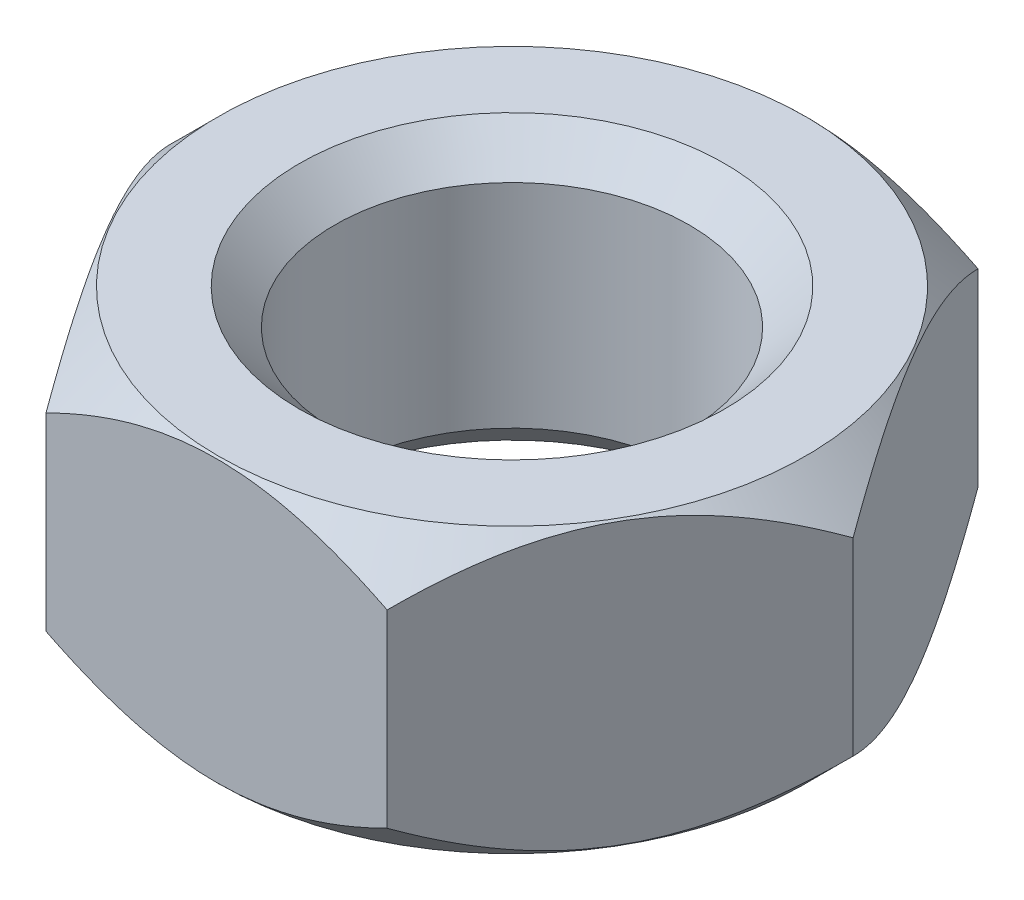
ISO-10303-21;
HEADER;
FILE_DESCRIPTION(('STEP AP214'),'2;1');
FILE_NAME('part.step','',(''),(''),'','','');
FILE_SCHEMA(('AUTOMOTIVE_DESIGN { 1 0 10303 214 1 1 1 1 }'));
ENDSEC;
DATA;
#1=APPLICATION_CONTEXT('core data for automotive mechanical design processes');
#2=APPLICATION_PROTOCOL_DEFINITION('international standard','automotive_design',2000,#1);
#3=PRODUCT_CONTEXT('',#1,'mechanical');
#4=PRODUCT('Part','Part','',(#3));
#5=PRODUCT_RELATED_PRODUCT_CATEGORY('part','',(#4));
#6=PRODUCT_DEFINITION_FORMATION('','',#4);
#7=PRODUCT_DEFINITION_CONTEXT('part definition',#1,'design');
#8=PRODUCT_DEFINITION('design','',#6,#7);
#9=PRODUCT_DEFINITION_SHAPE('','',#8);
#10=(LENGTH_UNIT() NAMED_UNIT(*) SI_UNIT(.MILLI.,.METRE.));
#11=(NAMED_UNIT(*) PLANE_ANGLE_UNIT() SI_UNIT($,.RADIAN.));
#12=(NAMED_UNIT(*) SI_UNIT($,.STERADIAN.) SOLID_ANGLE_UNIT());
#13=UNCERTAINTY_MEASURE_WITH_UNIT(LENGTH_MEASURE(1.E-05),#10,'distance_accuracy_value','');
#14=(GEOMETRIC_REPRESENTATION_CONTEXT(3) GLOBAL_UNCERTAINTY_ASSIGNED_CONTEXT((#13)) GLOBAL_UNIT_ASSIGNED_CONTEXT((#10,
#11,#12)) REPRESENTATION_CONTEXT('',''));
#15=CARTESIAN_POINT('',(0.,0.,0.));
#16=DIRECTION('',(0.,0.,1.));
#17=DIRECTION('',(1.,0.,0.));
#18=AXIS2_PLACEMENT_3D('',#15,#16,#17);
#19=CARTESIAN_POINT('',(-2.88675134594816,-2.4,0.));
#20=DIRECTION('',(-0.86602540378444,0.,-0.499999999999998));
#21=DIRECTION('',(-0.499999999999998,0.,0.86602540378444));
#22=AXIS2_PLACEMENT_3D('',#19,#20,#21);
#23=PLANE('',#22);
#24=CARTESIAN_POINT('',(-2.886866816002,-1.99988452301824,0.000200000000088099));
#25=CARTESIAN_POINT('',(-2.83725032818754,-2.04945929464528,-0.085738277787681));
#26=CARTESIAN_POINT('',(-2.78680418128112,-2.0961225186375,-0.173113567275674));
#27=CARTESIAN_POINT('',(-2.68393890266963,-2.18156185996172,-0.351281456165519));
#28=CARTESIAN_POINT('',(-2.63150998769862,-2.22029043759402,-0.44209100068101));
#29=CARTESIAN_POINT('',(-2.52578957716235,-2.28663329610229,-0.625204123126866));
#30=CARTESIAN_POINT('',(-2.47252500720905,-2.31441433146918,-0.71746106452929));
#31=CARTESIAN_POINT('',(-2.36482323343211,-2.35721682408937,-0.904006008776246));
#32=CARTESIAN_POINT('',(-2.31038931995913,-2.3722702333287,-0.998288312566249));
#33=CARTESIAN_POINT('',(-2.21657570605387,-2.38585227779056,-1.16077825829182));
#34=CARTESIAN_POINT('',(-2.17731721011878,-2.38786290075924,-1.22877596788012));
#35=CARTESIAN_POINT('',(-2.0988643883567,-2.38447588281256,-1.36466024116919));
#36=CARTESIAN_POINT('',(-2.05967008984862,-2.37907564470023,-1.43254675755221));
#37=CARTESIAN_POINT('',(-1.98165157555715,-2.36117421159758,-1.56767878823608));
#38=CARTESIAN_POINT('',(-1.94282782326097,-2.34866507295357,-1.63492349975353));
#39=CARTESIAN_POINT('',(-1.86585167424616,-2.31723249804434,-1.76825010081817));
#40=CARTESIAN_POINT('',(-1.82769922629678,-2.29830955350323,-1.83433207909963));
#41=CARTESIAN_POINT('',(-1.72997445583858,-2.2421326385918,-2.00359634669124));
#42=CARTESIAN_POINT('',(-1.67100807039231,-2.20064416840386,-2.10572912222287));
#43=CARTESIAN_POINT('',(-1.58430317001562,-2.13060595327696,-2.2559064149405));
#44=CARTESIAN_POINT('',(-1.55573003305807,-2.10599774788397,-2.3053965398826));
#45=CARTESIAN_POINT('',(-1.49911303110425,-2.0545381132848,-2.40346006383884));
#46=CARTESIAN_POINT('',(-1.47106885396705,-2.02768806122068,-2.45203400349692));
#47=CARTESIAN_POINT('',(-1.44326020292022,-1.99988452301827,-2.5002));
#48=B_SPLINE_CURVE_WITH_KNOTS('',3,(#24,#25,#26,#27,#28,#29,#30,#31,#32,#33,#34,#35,#36,#37,#38,
#39,#40,#41,#42,#43,#44,#45,#46,#47),.UNSPECIFIED.,.F.,.F.,(4,2,2,2,2,2,2,2,2,2,2,4),(0.,
0.333012085133944,0.667964518301437,0.997597032043358,1.32639954393852,1.56169424147176,
1.7970714210209,2.03271213522178,2.26833478775658,2.64260240809542,2.82922877818874,
3.01574133749036),.UNSPECIFIED.);
#49=CARTESIAN_POINT('',(-2.88675134594816,-2.,0.));
#50=VERTEX_POINT('',#49);
#51=CARTESIAN_POINT('',(-1.44337567297413,-2.,-2.5));
#52=VERTEX_POINT('',#51);
#53=EDGE_CURVE('E156',#50,#52,#48,.T.);
#54=ORIENTED_EDGE('',*,*,#53,.F.);
#55=DIRECTION('',(0.,1.,0.));
#56=VECTOR('',#55,1.);
#57=CARTESIAN_POINT('',(-2.88675134594816,-2.4,0.));
#58=LINE('',#57,#56);
#59=CARTESIAN_POINT('',(-2.88675134594816,-0.4,0.));
#60=VERTEX_POINT('',#59);
#61=EDGE_CURVE('E52',#50,#60,#58,.T.);
#62=ORIENTED_EDGE('',*,*,#61,.T.);
#63=CARTESIAN_POINT('',(-1.44326020292022,-0.400115476981726,-2.5002));
#64=CARTESIAN_POINT('',(-1.49287669073468,-0.350540705354688,-2.41426172221223));
#65=CARTESIAN_POINT('',(-1.54332283764109,-0.303877481362466,-2.32688643272424));
#66=CARTESIAN_POINT('',(-1.64618811625258,-0.21843814003826,-2.14871854383441));
#67=CARTESIAN_POINT('',(-1.69861703122358,-0.17970956240596,-2.05790899931892));
#68=CARTESIAN_POINT('',(-1.80433744175985,-0.113366703897696,-1.87479587687307));
#69=CARTESIAN_POINT('',(-1.85760201171315,-0.0855856685308129,-1.78253893547065));
#70=CARTESIAN_POINT('',(-1.96530378549008,-0.0427831759106217,-1.59599399122371));
#71=CARTESIAN_POINT('',(-2.01973769896306,-0.0277297666712993,-1.50171168743371));
#72=CARTESIAN_POINT('',(-2.11355131286832,-0.0141477222094366,-1.33922174170815));
#73=CARTESIAN_POINT('',(-2.1528098088034,-0.0121370992407565,-1.27122403211984));
#74=CARTESIAN_POINT('',(-2.23126263056548,-0.0155241171874431,-1.13533975883077));
#75=CARTESIAN_POINT('',(-2.27045692907356,-0.020924355299775,-1.06745324244776));
#76=CARTESIAN_POINT('',(-2.34847544336503,-0.0388257884024258,-0.93232121176389));
#77=CARTESIAN_POINT('',(-2.38729919566121,-0.0513349270464343,-0.865076500246436));
#78=CARTESIAN_POINT('',(-2.46427534467602,-0.0827675019556602,-0.731749899181798));
#79=CARTESIAN_POINT('',(-2.5024277926254,-0.101690446496771,-0.66566792090034));
#80=CARTESIAN_POINT('',(-2.60015256308361,-0.157867361408205,-0.496403653308718));
#81=CARTESIAN_POINT('',(-2.65911894852989,-0.199355831596151,-0.394270877777074));
#82=CARTESIAN_POINT('',(-2.74582384890658,-0.269394046723064,-0.244093585059437));
#83=CARTESIAN_POINT('',(-2.77439698586414,-0.294002252116055,-0.19460346011733));
#84=CARTESIAN_POINT('',(-2.83101398781796,-0.345461886715226,-0.0965399361610786));
#85=CARTESIAN_POINT('',(-2.85905816495516,-0.372311938779351,-0.0479659965029907));
#86=CARTESIAN_POINT('',(-2.886866816002,-0.400115476981764,0.000200000000088264));
#87=B_SPLINE_CURVE_WITH_KNOTS('',3,(#63,#64,#65,#66,#67,#68,#69,#70,#71,#72,#73,#74,#75,#76,#77,
#78,#79,#80,#81,#82,#83,#84,#85,#86),.UNSPECIFIED.,.F.,.F.,(4,2,2,2,2,2,2,2,2,2,2,4),(0.,
0.333012085133927,0.667964518301402,0.997597032043305,1.32639954393845,1.56169424147169,
1.79707142102083,2.03271213522171,2.26833478775651,2.64260240809539,2.82922877818872,
3.01574133749036),.UNSPECIFIED.);
#88=CARTESIAN_POINT('',(-1.44337567297413,-0.4,-2.5));
#89=VERTEX_POINT('',#88);
#90=EDGE_CURVE('E112',#89,#60,#87,.T.);
#91=ORIENTED_EDGE('',*,*,#90,.F.);
#92=DIRECTION('',(0.,1.,0.));
#93=VECTOR('',#92,1.);
#94=CARTESIAN_POINT('',(-1.44337567297406,-2.4,-2.5));
#95=LINE('',#94,#93);
#96=EDGE_CURVE('E117',#52,#89,#95,.T.);
#97=ORIENTED_EDGE('',*,*,#96,.F.);
#98=EDGE_LOOP('',(#54,#62,#91,#97));
#99=FACE_BOUND('',#98,.T.);
#100=ADVANCED_FACE('F29',(#99),#23,.T.);
#101=CARTESIAN_POINT('',(-1.44337567297406,-2.4,-2.5));
#102=DIRECTION('',(0.,0.,-1.));
#103=DIRECTION('',(-1.,0.,0.));
#104=AXIS2_PLACEMENT_3D('',#101,#102,#103);
#105=PLANE('',#104);
#106=CARTESIAN_POINT('',(-3.00686055371766,-0.976353618158406,-2.5));
#107=CARTESIAN_POINT('',(-2.93419555888552,-1.03221607337774,-2.5));
#108=CARTESIAN_POINT('',(-2.8611384247871,-1.08757646670912,-2.5));
#109=CARTESIAN_POINT('',(-2.71407981532172,-1.19706393459546,-2.5));
#110=CARTESIAN_POINT('',(-2.64007812012032,-1.25119071356557,-2.5));
#111=CARTESIAN_POINT('',(-2.49042948244741,-1.35836696314182,-2.5));
#112=CARTESIAN_POINT('',(-2.41477425074887,-1.4114048975212,-2.5));
#113=CARTESIAN_POINT('',(-2.26220362121972,-1.51562994486785,-2.5));
#114=CARTESIAN_POINT('',(-2.18528831077203,-1.56681718539265,-2.5));
#115=CARTESIAN_POINT('',(-2.02506944859289,-1.6700886834191,-2.5));
#116=CARTESIAN_POINT('',(-1.94166976020541,-1.72202454073649,-2.5));
#117=CARTESIAN_POINT('',(-1.77293705034365,-1.82264970945442,-2.5));
#118=CARTESIAN_POINT('',(-1.68760428279983,-1.87133944399226,-2.5));
#119=CARTESIAN_POINT('',(-1.51494654751409,-1.9644589961223,-2.5));
#120=CARTESIAN_POINT('',(-1.42762805695319,-2.00890072943998,-2.5));
#121=CARTESIAN_POINT('',(-1.25052598836292,-2.09252041448136,-2.5));
#122=CARTESIAN_POINT('',(-1.16074359560958,-2.13170084552657,-2.5));
#123=CARTESIAN_POINT('',(-0.98744876450011,-2.19986634956689,-2.5));
#124=CARTESIAN_POINT('',(-0.904183815953156,-2.22947420660822,-2.5));
#125=CARTESIAN_POINT('',(-0.735537147436124,-2.28202460534028,-2.5));
#126=CARTESIAN_POINT('',(-0.65015529262312,-2.30496672124592,-2.5));
#127=CARTESIAN_POINT('',(-0.479269044896119,-2.34256324017883,-2.5));
#128=CARTESIAN_POINT('',(-0.39379825748821,-2.35736782471579,-2.5));
#129=CARTESIAN_POINT('',(-0.221800656818383,-2.37838119922811,-2.5));
#130=CARTESIAN_POINT('',(-0.135274064759336,-2.38459175958053,-2.5));
#131=CARTESIAN_POINT('',(0.0341972844239789,-2.38789077242592,-2.5));
#132=CARTESIAN_POINT('',(0.117134633959634,-2.38536316670756,-2.5));
#133=CARTESIAN_POINT('',(0.282359134963951,-2.37220538779436,-2.5));
#134=CARTESIAN_POINT('',(0.364646226507277,-2.36157447642817,-2.5));
#135=CARTESIAN_POINT('',(0.529371902600402,-2.33263042886053,-2.5));
#136=CARTESIAN_POINT('',(0.6117863224983,-2.31418185991864,-2.5));
#137=CARTESIAN_POINT('',(0.774792600762078,-2.27062146640925,-2.5));
#138=CARTESIAN_POINT('',(0.855384564360703,-2.24551002764257,-2.5));
#139=CARTESIAN_POINT('',(1.1036144369275,-2.15857448547193,-2.5));
#140=CARTESIAN_POINT('',(1.26787783896323,-2.08708426100726,-2.5));
#141=CARTESIAN_POINT('',(1.50828630391717,-1.9678317101188,-2.5));
#142=CARTESIAN_POINT('',(1.58757208675449,-1.92598541374091,-2.5));
#143=CARTESIAN_POINT('',(1.74434886235114,-1.83904848715485,-2.5));
#144=CARTESIAN_POINT('',(1.82184016785801,-1.79395842799223,-2.5));
#145=CARTESIAN_POINT('',(1.97144914574765,-1.70347587232084,-2.5));
#146=CARTESIAN_POINT('',(2.04364321095733,-1.65820826454684,-2.5));
#147=CARTESIAN_POINT('',(2.18679260951688,-1.56574579934053,-2.5));
#148=CARTESIAN_POINT('',(2.25774784938503,-1.5185507973567,-2.5));
#149=CARTESIAN_POINT('',(2.39800921618397,-1.42296288976774,-2.5));
#150=CARTESIAN_POINT('',(2.46732401135529,-1.37458265081056,-2.5));
#151=CARTESIAN_POINT('',(2.60500280846684,-1.27652582638536,-2.5));
#152=CARTESIAN_POINT('',(2.67336706722706,-1.22684960193218,-2.5));
#153=CARTESIAN_POINT('',(2.74133281290672,-1.17664277730505,-2.5));
#154=B_SPLINE_CURVE_WITH_KNOTS('',3,(#106,#107,#108,#109,#110,#111,#112,#113,#114,#115,#116,
#117,#118,#119,#120,#121,#122,#123,#124,#125,#126,#127,#128,#129,#130,#131,#132,#133,#134,#135,
#136,#137,#138,#139,#140,#141,#142,#143,#144,#145,#146,#147,#148,#149,#150,#151,#152,#153),
.UNSPECIFIED.,.F.,.F.,(4,2,2,2,2,2,2,2,2,2,2,2,2,2,2,2,2,2,2,2,2,2,2,4),(0.,0.274972945669422,
0.550011098949862,0.827171617457954,1.10431299634799,1.39900138095483,1.6936512770503,
1.98744880343442,2.28110739196182,2.54599586001028,2.81090124452367,3.07073779539666,
3.33052081172374,3.57903710621171,3.82757604201934,4.08060901187179,4.3336273335272,
4.86940614188284,5.13833706913142,5.40722076796741,5.66282656673244,5.9184515708595,
6.17202334349369,6.42552521890798),.UNSPECIFIED.);
#155=CARTESIAN_POINT('',(1.44337567297403,-2.,-2.50000000000005));
#156=VERTEX_POINT('',#155);
#157=EDGE_CURVE('E159',#52,#156,#154,.T.);
#158=ORIENTED_EDGE('',*,*,#157,.F.);
#159=ORIENTED_EDGE('',*,*,#96,.T.);
#160=CARTESIAN_POINT('',(-3.00686055371766,-1.42364638184159,-2.5));
#161=CARTESIAN_POINT('',(-2.93419555888552,-1.36778392662226,-2.5));
#162=CARTESIAN_POINT('',(-2.86113842478711,-1.31242353329088,-2.5));
#163=CARTESIAN_POINT('',(-2.71407981532172,-1.20293606540454,-2.5));
#164=CARTESIAN_POINT('',(-2.64007812012033,-1.14880928643443,-2.5));
#165=CARTESIAN_POINT('',(-2.49042948244741,-1.04163303685818,-2.5));
#166=CARTESIAN_POINT('',(-2.41477425074887,-0.988595102478801,-2.5));
#167=CARTESIAN_POINT('',(-2.26220362121972,-0.884370055132155,-2.5));
#168=CARTESIAN_POINT('',(-2.18528831077203,-0.833182814607346,-2.5));
#169=CARTESIAN_POINT('',(-2.0250694485929,-0.729911316580901,-2.5));
#170=CARTESIAN_POINT('',(-1.94166976020541,-0.677975459263515,-2.5));
#171=CARTESIAN_POINT('',(-1.77293705034366,-0.577350290545577,-2.5));
#172=CARTESIAN_POINT('',(-1.68760428279983,-0.528660556007737,-2.5));
#173=CARTESIAN_POINT('',(-1.51494654751409,-0.435541003877702,-2.5));
#174=CARTESIAN_POINT('',(-1.42762805695319,-0.391099270560025,-2.5));
#175=CARTESIAN_POINT('',(-1.25052598836292,-0.307479585518642,-2.5));
#176=CARTESIAN_POINT('',(-1.16074359560958,-0.268299154473432,-2.5));
#177=CARTESIAN_POINT('',(-0.987448764500111,-0.200133650433108,-2.5));
#178=CARTESIAN_POINT('',(-0.904183815953156,-0.170525793391776,-2.5));
#179=CARTESIAN_POINT('',(-0.735537147436124,-0.117975394659717,-2.5));
#180=CARTESIAN_POINT('',(-0.65015529262312,-0.0950332787540773,-2.5));
#181=CARTESIAN_POINT('',(-0.479269044896119,-0.057436759821169,-2.5));
#182=CARTESIAN_POINT('',(-0.393798257488211,-0.0426321752842073,-2.5));
#183=CARTESIAN_POINT('',(-0.221800656818383,-0.0216188007718851,-2.5));
#184=CARTESIAN_POINT('',(-0.135274064759336,-0.0154082404194727,-2.5));
#185=CARTESIAN_POINT('',(0.0341972844239785,-0.012109227574078,-2.5));
#186=CARTESIAN_POINT('',(0.117134633959634,-0.0146368332924353,-2.5));
#187=CARTESIAN_POINT('',(0.28235913496395,-0.0277946122056384,-2.5));
#188=CARTESIAN_POINT('',(0.364646226507277,-0.0384255235718258,-2.5));
#189=CARTESIAN_POINT('',(0.529371902600402,-0.0673695711394719,-2.5));
#190=CARTESIAN_POINT('',(0.6117863224983,-0.085818140081362,-2.5));
#191=CARTESIAN_POINT('',(0.774792600762078,-0.129378533590748,-2.5));
#192=CARTESIAN_POINT('',(0.855384564360703,-0.15448997235743,-2.5));
#193=CARTESIAN_POINT('',(1.1036144369275,-0.241425514528068,-2.5));
#194=CARTESIAN_POINT('',(1.26787783896323,-0.31291573899274,-2.5));
#195=CARTESIAN_POINT('',(1.50828630391717,-0.432168289881204,-2.5));
#196=CARTESIAN_POINT('',(1.58757208675449,-0.474014586259089,-2.5));
#197=CARTESIAN_POINT('',(1.74434886235114,-0.560951512845149,-2.5));
#198=CARTESIAN_POINT('',(1.82184016785801,-0.606041572007765,-2.5));
#199=CARTESIAN_POINT('',(1.97144914574765,-0.696524127679163,-2.5));
#200=CARTESIAN_POINT('',(2.04364321095733,-0.741791735453161,-2.5));
#201=CARTESIAN_POINT('',(2.18679260951688,-0.834254200659471,-2.5));
#202=CARTESIAN_POINT('',(2.25774784938503,-0.881449202643297,-2.5));
#203=CARTESIAN_POINT('',(2.39800921618397,-0.977037110232258,-2.5));
#204=CARTESIAN_POINT('',(2.4673240113553,-1.02541734918944,-2.5));
#205=CARTESIAN_POINT('',(2.60500280846685,-1.12347417361463,-2.5));
#206=CARTESIAN_POINT('',(2.67336706722706,-1.17315039806782,-2.5));
#207=CARTESIAN_POINT('',(2.74133281290672,-1.22335722269495,-2.5));
#208=B_SPLINE_CURVE_WITH_KNOTS('',3,(#160,#161,#162,#163,#164,#165,#166,#167,#168,#169,#170,
#171,#172,#173,#174,#175,#176,#177,#178,#179,#180,#181,#182,#183,#184,#185,#186,#187,#188,#189,
#190,#191,#192,#193,#194,#195,#196,#197,#198,#199,#200,#201,#202,#203,#204,#205,#206,#207),
.UNSPECIFIED.,.F.,.F.,(4,2,2,2,2,2,2,2,2,2,2,2,2,2,2,2,2,2,2,2,2,2,2,4),(0.,0.274972945669422,
0.550011098949862,0.827171617457952,1.10431299634798,1.39900138095483,1.6936512770503,
1.98744880343442,2.28110739196182,2.54599586001029,2.81090124452367,3.07073779539666,
3.33052081172374,3.57903710621171,3.82757604201934,4.08060901187179,4.3336273335272,
4.86940614188284,5.13833706913142,5.40722076796742,5.66282656673244,5.9184515708595,
6.17202334349369,6.42552521890798),.UNSPECIFIED.);
#209=CARTESIAN_POINT('',(1.44337567297404,-0.4,-2.50000000000006));
#210=VERTEX_POINT('',#209);
#211=EDGE_CURVE('E203',#210,#89,#208,.F.);
#212=ORIENTED_EDGE('',*,*,#211,.F.);
#213=DIRECTION('',(0.,1.,0.));
#214=VECTOR('',#213,1.);
#215=CARTESIAN_POINT('',(1.44337567297407,-2.4,-2.5));
#216=LINE('',#215,#214);
#217=EDGE_CURVE('E106',#156,#210,#216,.T.);
#218=ORIENTED_EDGE('',*,*,#217,.F.);
#219=EDGE_LOOP('',(#158,#159,#212,#218));
#220=FACE_BOUND('',#219,.T.);
#221=ADVANCED_FACE('F148',(#220),#105,.T.);
#222=CARTESIAN_POINT('',(1.44337567297407,-2.4,-2.5));
#223=DIRECTION('',(0.866025403784439,0.,-0.499999999999999));
#224=DIRECTION('',(-0.5,0.,-0.866025403784439));
#225=AXIS2_PLACEMENT_3D('',#222,#223,#224);
#226=PLANE('',#225);
#227=CARTESIAN_POINT('',(1.44326020292023,-1.99988452301827,-2.5002));
#228=CARTESIAN_POINT('',(1.49287669073469,-2.0494592946453,-2.41426172221224));
#229=CARTESIAN_POINT('',(1.5433228376411,-2.09612251863753,-2.32688643272425));
#230=CARTESIAN_POINT('',(1.64618811625259,-2.18156185996173,-2.14871854383441));
#231=CARTESIAN_POINT('',(1.6986170312236,-2.22029043759403,-2.05790899931893));
#232=CARTESIAN_POINT('',(1.80433744175986,-2.28663329610229,-1.87479587687308));
#233=CARTESIAN_POINT('',(1.85760201171316,-2.31441433146918,-1.78253893547066));
#234=CARTESIAN_POINT('',(1.96530378549009,-2.35721682408937,-1.59599399122372));
#235=CARTESIAN_POINT('',(2.01973769896306,-2.37227023332869,-1.50171168743372));
#236=CARTESIAN_POINT('',(2.11355131286833,-2.38585227779055,-1.33922174170816));
#237=CARTESIAN_POINT('',(2.15280980880341,-2.38786290075923,-1.27122403211985));
#238=CARTESIAN_POINT('',(2.23126263056549,-2.38447588281254,-1.13533975883078));
#239=CARTESIAN_POINT('',(2.27045692907357,-2.37907564470021,-1.06745324244777));
#240=CARTESIAN_POINT('',(2.34847544336504,-2.36117421159756,-0.932321211763899));
#241=CARTESIAN_POINT('',(2.38729919566123,-2.34866507295355,-0.865076500246444));
#242=CARTESIAN_POINT('',(2.46427534467603,-2.31723249804433,-0.731749899181806));
#243=CARTESIAN_POINT('',(2.50242779262541,-2.29830955350321,-0.665667920900348));
#244=CARTESIAN_POINT('',(2.60015256308362,-2.24213263859179,-0.496403653308737));
#245=CARTESIAN_POINT('',(2.65911894852989,-2.20064416840384,-0.394270877777105));
#246=CARTESIAN_POINT('',(2.74582384890657,-2.13060595327694,-0.244093585059483));
#247=CARTESIAN_POINT('',(2.77439698586413,-2.10599774788395,-0.194603460117381));
#248=CARTESIAN_POINT('',(2.83101398781794,-2.05453811328479,-0.0965399361611407));
#249=CARTESIAN_POINT('',(2.85905816495514,-2.02768806122067,-0.047965996503058));
#250=CARTESIAN_POINT('',(2.88686681600198,-1.99988452301826,0.000200000000016019));
#251=B_SPLINE_CURVE_WITH_KNOTS('',3,(#227,#228,#229,#230,#231,#232,#233,#234,#235,#236,#237,
#238,#239,#240,#241,#242,#243,#244,#245,#246,#247,#248,#249,#250),.UNSPECIFIED.,.F.,.F.,(4,2,2,
2,2,2,2,2,2,2,2,4),(0.,0.333012085133924,0.667964518301397,0.997597032043298,1.32639954393844,
1.56169424147168,1.79707142102082,2.0327121352217,2.2683347877565,2.64260240809534,
2.82922877818865,3.01574133749027),.UNSPECIFIED.);
#252=CARTESIAN_POINT('',(2.88675134594816,-2.,0.));
#253=VERTEX_POINT('',#252);
#254=EDGE_CURVE('E86',#156,#253,#251,.T.);
#255=ORIENTED_EDGE('',*,*,#254,.F.);
#256=ORIENTED_EDGE('',*,*,#217,.T.);
#257=CARTESIAN_POINT('',(2.88686681600198,-0.400115476981741,0.000200000000016092));
#258=CARTESIAN_POINT('',(2.83725032818752,-0.350540705354703,-0.0857382777877494));
#259=CARTESIAN_POINT('',(2.7868041812811,-0.303877481362481,-0.173113567275739));
#260=CARTESIAN_POINT('',(2.68393890266961,-0.218438140038274,-0.351281456165575));
#261=CARTESIAN_POINT('',(2.63150998769861,-0.179709562405974,-0.442091000681062));
#262=CARTESIAN_POINT('',(2.52578957716234,-0.113366703897709,-0.62520412312691));
#263=CARTESIAN_POINT('',(2.47252500720904,-0.0855856685308262,-0.71746106452933));
#264=CARTESIAN_POINT('',(2.36482323343211,-0.042783175910635,-0.904006008776277));
#265=CARTESIAN_POINT('',(2.31038931995913,-0.0277297666713128,-0.998288312566275));
#266=CARTESIAN_POINT('',(2.21657570605387,-0.0141477222094498,-1.16077825829184));
#267=CARTESIAN_POINT('',(2.17731721011879,-0.0121370992407694,-1.22877596788014));
#268=CARTESIAN_POINT('',(2.09886438835671,-0.0155241171874556,-1.36466024116921));
#269=CARTESIAN_POINT('',(2.05967008984862,-0.0209243552997876,-1.43254675755223));
#270=CARTESIAN_POINT('',(1.98165157555715,-0.0388257884024387,-1.5676787882361));
#271=CARTESIAN_POINT('',(1.94282782326097,-0.0513349270464473,-1.63492349975355));
#272=CARTESIAN_POINT('',(1.86585167424617,-0.0827675019556733,-1.76825010081819));
#273=CARTESIAN_POINT('',(1.82769922629678,-0.101690446496784,-1.83433207909965));
#274=CARTESIAN_POINT('',(1.72997445583858,-0.157867361408213,-2.00359634669126));
#275=CARTESIAN_POINT('',(1.67100807039231,-0.199355831596154,-2.10572912222289));
#276=CARTESIAN_POINT('',(1.58430317001563,-0.269394046723055,-2.25590641494051));
#277=CARTESIAN_POINT('',(1.55573003305808,-0.294002252116041,-2.30539653988261));
#278=CARTESIAN_POINT('',(1.49911303110426,-0.345461886715204,-2.40346006383885));
#279=CARTESIAN_POINT('',(1.47106885396706,-0.372311938779324,-2.45203400349693));
#280=CARTESIAN_POINT('',(1.44326020292023,-0.400115476981733,-2.5002));
#281=B_SPLINE_CURVE_WITH_KNOTS('',3,(#257,#258,#259,#260,#261,#262,#263,#264,#265,#266,#267,
#268,#269,#270,#271,#272,#273,#274,#275,#276,#277,#278,#279,#280),.UNSPECIFIED.,.F.,.F.,(4,2,2,
2,2,2,2,2,2,2,2,4),(0.,0.333012085133928,0.667964518301404,0.997597032043309,1.32639954393846,
1.5616942414717,1.79707142102084,2.03271213522172,2.26833478775652,2.64260240809535,
2.82922877818866,3.01574133749027),.UNSPECIFIED.);
#282=CARTESIAN_POINT('',(2.88675134594816,-0.4,0.));
#283=VERTEX_POINT('',#282);
#284=EDGE_CURVE('E197',#283,#210,#281,.T.);
#285=ORIENTED_EDGE('',*,*,#284,.F.);
#286=DIRECTION('',(0.,1.,0.));
#287=VECTOR('',#286,1.);
#288=CARTESIAN_POINT('',(2.88675134594814,-2.4,0.));
#289=LINE('',#288,#287);
#290=EDGE_CURVE('E104',#253,#283,#289,.T.);
#291=ORIENTED_EDGE('',*,*,#290,.F.);
#292=EDGE_LOOP('',(#255,#256,#285,#291));
#293=FACE_BOUND('',#292,.T.);
#294=ADVANCED_FACE('F153',(#293),#226,.T.);
#295=CARTESIAN_POINT('',(2.88675134594814,-2.4,0.));
#296=DIRECTION('',(0.866025403784436,0.,0.500000000000005));
#297=DIRECTION('',(0.500000000000005,0.,-0.866025403784436));
#298=AXIS2_PLACEMENT_3D('',#295,#296,#297);
#299=PLANE('',#298);
#300=CARTESIAN_POINT('',(2.88686681600198,-1.99988452301826,-0.000199999999983968));
#301=CARTESIAN_POINT('',(2.83725032818752,-2.0494592946453,0.0857382777877805));
#302=CARTESIAN_POINT('',(2.7868041812811,-2.09612251863752,0.173113567275769));
#303=CARTESIAN_POINT('',(2.68393890266961,-2.18156185996172,0.351281456165604));
#304=CARTESIAN_POINT('',(2.63150998769861,-2.22029043759402,0.442091000681089));
#305=CARTESIAN_POINT('',(2.52578957716234,-2.28663329610229,0.625204123126935));
#306=CARTESIAN_POINT('',(2.47252500720904,-2.31441433146917,0.717461064529354));
#307=CARTESIAN_POINT('',(2.3648232334321,-2.35721682408936,0.904006008776299));
#308=CARTESIAN_POINT('',(2.31038931995913,-2.37227023332868,0.998288312566296));
#309=CARTESIAN_POINT('',(2.21657570605387,-2.38585227779054,1.16077825829186));
#310=CARTESIAN_POINT('',(2.17731721011878,-2.38786290075922,1.22877596788016));
#311=CARTESIAN_POINT('',(2.0988643883567,-2.38447588281254,1.36466024116923));
#312=CARTESIAN_POINT('',(2.05967008984862,-2.37907564470021,1.43254675755225));
#313=CARTESIAN_POINT('',(1.98165157555715,-2.36117421159755,1.56767878823612));
#314=CARTESIAN_POINT('',(1.94282782326097,-2.34866507295354,1.63492349975357));
#315=CARTESIAN_POINT('',(1.86585167424616,-2.31723249804432,1.76825010081821));
#316=CARTESIAN_POINT('',(1.82769922629677,-2.29830955350321,1.83433207909967));
#317=CARTESIAN_POINT('',(1.72997445583857,-2.24213263859178,2.00359634669128));
#318=CARTESIAN_POINT('',(1.67100807039229,-2.20064416840383,2.10572912222292));
#319=CARTESIAN_POINT('',(1.5843031700156,-2.13060595327693,2.25590641494055));
#320=CARTESIAN_POINT('',(1.55573003305805,-2.10599774788394,2.30539653988265));
#321=CARTESIAN_POINT('',(1.49911303110423,-2.05453811328477,2.40346006383889));
#322=CARTESIAN_POINT('',(1.47106885396703,-2.02768806122065,2.45203400349698));
#323=CARTESIAN_POINT('',(1.44326020292019,-1.99988452301824,2.50020000000006));
#324=B_SPLINE_CURVE_WITH_KNOTS('',3,(#300,#301,#302,#303,#304,#305,#306,#307,#308,#309,#310,
#311,#312,#313,#314,#315,#316,#317,#318,#319,#320,#321,#322,#323),.UNSPECIFIED.,.F.,.F.,(4,2,2,
2,2,2,2,2,2,2,2,4),(0.,0.333012085133925,0.667964518301398,0.9975970320433,1.32639954393844,
1.56169424147169,1.79707142102083,2.03271213522171,2.26833478775651,2.64260240809536,
2.82922877818868,3.01574133749031),.UNSPECIFIED.);
#325=CARTESIAN_POINT('',(1.44337567297403,-2.,2.50000000000005));
#326=VERTEX_POINT('',#325);
#327=EDGE_CURVE('E82',#253,#326,#324,.T.);
#328=ORIENTED_EDGE('',*,*,#327,.F.);
#329=ORIENTED_EDGE('',*,*,#290,.T.);
#330=CARTESIAN_POINT('',(1.44326020292019,-0.400115476981763,2.50020000000006));
#331=CARTESIAN_POINT('',(1.49287669073465,-0.350540705354724,2.41426172221229));
#332=CARTESIAN_POINT('',(1.54332283764107,-0.3038774813625,2.3268864327243));
#333=CARTESIAN_POINT('',(1.64618811625257,-0.21843814003829,2.14871854383446));
#334=CARTESIAN_POINT('',(1.69861703122357,-0.179709562405988,2.05790899931897));
#335=CARTESIAN_POINT('',(1.80433744175984,-0.113366703897721,1.87479587687312));
#336=CARTESIAN_POINT('',(1.85760201171314,-0.0855856685308365,1.7825389354707));
#337=CARTESIAN_POINT('',(1.96530378549008,-0.0427831759106434,1.59599399122374));
#338=CARTESIAN_POINT('',(2.01973769896306,-0.0277297666713203,1.50171168743374));
#339=CARTESIAN_POINT('',(2.11355131286832,-0.0141477222094569,1.33922174170818));
#340=CARTESIAN_POINT('',(2.15280980880341,-0.0121370992407765,1.27122403211987));
#341=CARTESIAN_POINT('',(2.23126263056549,-0.0155241171874628,1.13533975883081));
#342=CARTESIAN_POINT('',(2.27045692907357,-0.0209243552997947,1.06745324244779));
#343=CARTESIAN_POINT('',(2.34847544336504,-0.0388257884024455,0.932321211763919));
#344=CARTESIAN_POINT('',(2.38729919566122,-0.051334927046454,0.865076500246465));
#345=CARTESIAN_POINT('',(2.46427534467603,-0.08276750195568,0.731749899181826));
#346=CARTESIAN_POINT('',(2.50242779262542,-0.101690446496791,0.665667920900368));
#347=CARTESIAN_POINT('',(2.60015256308362,-0.15786736140822,0.496403653308759));
#348=CARTESIAN_POINT('',(2.65911894852989,-0.199355831596161,0.394270877777129));
#349=CARTESIAN_POINT('',(2.74582384890658,-0.269394046723062,0.244093585059511));
#350=CARTESIAN_POINT('',(2.77439698586413,-0.294002252116049,0.19460346011741));
#351=CARTESIAN_POINT('',(2.83101398781794,-0.345461886715211,0.0965399361611708));
#352=CARTESIAN_POINT('',(2.85905816495514,-0.372311938779332,0.0479659965030887));
#353=CARTESIAN_POINT('',(2.88686681600198,-0.400115476981741,-0.000199999999984082));
#354=B_SPLINE_CURVE_WITH_KNOTS('',3,(#330,#331,#332,#333,#334,#335,#336,#337,#338,#339,#340,
#341,#342,#343,#344,#345,#346,#347,#348,#349,#350,#351,#352,#353),.UNSPECIFIED.,.F.,.F.,(4,2,2,
2,2,2,2,2,2,2,2,4),(0.,0.333012085133936,0.66796451830142,0.997597032043333,1.32639954393849,
1.56169424147173,1.79707142102087,2.03271213522175,2.26833478775655,2.64260240809538,
2.82922877818869,3.01574133749031),.UNSPECIFIED.);
#355=CARTESIAN_POINT('',(1.44337567297403,-0.4,2.50000000000006));
#356=VERTEX_POINT('',#355);
#357=EDGE_CURVE('E103',#356,#283,#354,.T.);
#358=ORIENTED_EDGE('',*,*,#357,.F.);
#359=DIRECTION('',(0.,1.,0.));
#360=VECTOR('',#359,1.);
#361=CARTESIAN_POINT('',(1.44337567297403,-2.4,2.50000000000006));
#362=LINE('',#361,#360);
#363=EDGE_CURVE('E95',#326,#356,#362,.T.);
#364=ORIENTED_EDGE('',*,*,#363,.F.);
#365=EDGE_LOOP('',(#328,#329,#358,#364));
#366=FACE_BOUND('',#365,.T.);
#367=ADVANCED_FACE('F101',(#366),#299,.T.);
#368=CARTESIAN_POINT('',(1.44337567297403,-2.4,2.50000000000006));
#369=DIRECTION('',(0.,0.,1.));
#370=DIRECTION('',(1.,0.,0.));
#371=AXIS2_PLACEMENT_3D('',#368,#369,#370);
#372=PLANE('',#371);
#373=CARTESIAN_POINT('',(-3.00686055371769,-0.976353618158347,2.50000000000006));
#374=CARTESIAN_POINT('',(-2.93419555888555,-1.03221607337768,2.50000000000006));
#375=CARTESIAN_POINT('',(-2.86113842478713,-1.08757646670906,2.50000000000006));
#376=CARTESIAN_POINT('',(-2.71407981532175,-1.1970639345954,2.50000000000006));
#377=CARTESIAN_POINT('',(-2.64007812012035,-1.25119071356551,2.50000000000006));
#378=CARTESIAN_POINT('',(-2.49042948244744,-1.35836696314176,2.50000000000006));
#379=CARTESIAN_POINT('',(-2.41477425074889,-1.41140489752114,2.50000000000006));
#380=CARTESIAN_POINT('',(-2.26220362121974,-1.51562994486779,2.50000000000006));
#381=CARTESIAN_POINT('',(-2.18528831077205,-1.5668171853926,2.50000000000006));
#382=CARTESIAN_POINT('',(-2.02506944859291,-1.67008868341904,2.50000000000006));
#383=CARTESIAN_POINT('',(-1.94166976020543,-1.72202454073643,2.50000000000006));
#384=CARTESIAN_POINT('',(-1.77293705034367,-1.82264970945437,2.50000000000006));
#385=CARTESIAN_POINT('',(-1.68760428279984,-1.87133944399221,2.50000000000006));
#386=CARTESIAN_POINT('',(-1.5149465475141,-1.96445899612224,2.50000000000006));
#387=CARTESIAN_POINT('',(-1.4276280569532,-2.00890072943992,2.50000000000006));
#388=CARTESIAN_POINT('',(-1.25052598836293,-2.0925204144813,2.50000000000006));
#389=CARTESIAN_POINT('',(-1.16074359560959,-2.13170084552651,2.50000000000006));
#390=CARTESIAN_POINT('',(-0.987448764500116,-2.19986634956684,2.50000000000006));
#391=CARTESIAN_POINT('',(-0.904183815953161,-2.22947420660817,2.50000000000006));
#392=CARTESIAN_POINT('',(-0.735537147436126,-2.28202460534023,2.50000000000006));
#393=CARTESIAN_POINT('',(-0.650155292623121,-2.30496672124587,2.50000000000006));
#394=CARTESIAN_POINT('',(-0.479269044896117,-2.34256324017878,2.50000000000006));
#395=CARTESIAN_POINT('',(-0.393798257488207,-2.35736782471574,2.50000000000006));
#396=CARTESIAN_POINT('',(-0.221800656818378,-2.37838119922806,2.50000000000006));
#397=CARTESIAN_POINT('',(-0.135274064759329,-2.38459175958047,2.50000000000006));
#398=CARTESIAN_POINT('',(0.0341972844239877,-2.38789077242587,2.50000000000006));
#399=CARTESIAN_POINT('',(0.117134633959645,-2.38536316670751,2.50000000000006));
#400=CARTESIAN_POINT('',(0.282359134963964,-2.3722053877943,2.50000000000006));
#401=CARTESIAN_POINT('',(0.364646226507292,-2.36157447642812,2.50000000000006));
#402=CARTESIAN_POINT('',(0.529371902600419,-2.33263042886047,2.50000000000006));
#403=CARTESIAN_POINT('',(0.611786322498318,-2.31418185991858,2.50000000000006));
#404=CARTESIAN_POINT('',(0.774792600762099,-2.27062146640919,2.50000000000006));
#405=CARTESIAN_POINT('',(0.855384564360725,-2.24551002764251,2.50000000000006));
#406=CARTESIAN_POINT('',(1.10361443692753,-2.15857448547187,2.50000000000006));
#407=CARTESIAN_POINT('',(1.26787783896326,-2.0870842610072,2.50000000000006));
#408=CARTESIAN_POINT('',(1.5082863039172,-1.96783171011873,2.50000000000006));
#409=CARTESIAN_POINT('',(1.58757208675453,-1.92598541374084,2.50000000000006));
#410=CARTESIAN_POINT('',(1.74434886235118,-1.83904848715478,2.50000000000006));
#411=CARTESIAN_POINT('',(1.82184016785805,-1.79395842799216,2.50000000000006));
#412=CARTESIAN_POINT('',(1.9714491457477,-1.70347587232076,2.50000000000006));
#413=CARTESIAN_POINT('',(2.04364321095738,-1.65820826454676,2.50000000000006));
#414=CARTESIAN_POINT('',(2.18679260951694,-1.56574579934045,2.50000000000006));
#415=CARTESIAN_POINT('',(2.25774784938509,-1.51855079735662,2.50000000000006));
#416=CARTESIAN_POINT('',(2.39800921618402,-1.42296288976766,2.50000000000006));
#417=CARTESIAN_POINT('',(2.46732401135535,-1.37458265081048,2.50000000000006));
#418=CARTESIAN_POINT('',(2.60500280846691,-1.27652582638528,2.50000000000006));
#419=CARTESIAN_POINT('',(2.67336706722712,-1.22684960193209,2.50000000000006));
#420=CARTESIAN_POINT('',(2.74133281290678,-1.17664277730496,2.50000000000006));
#421=B_SPLINE_CURVE_WITH_KNOTS('',3,(#373,#374,#375,#376,#377,#378,#379,#380,#381,#382,#383,
#384,#385,#386,#387,#388,#389,#390,#391,#392,#393,#394,#395,#396,#397,#398,#399,#400,#401,#402,
#403,#404,#405,#406,#407,#408,#409,#410,#411,#412,#413,#414,#415,#416,#417,#418,#419,#420),
.UNSPECIFIED.,.F.,.F.,(4,2,2,2,2,2,2,2,2,2,2,2,2,2,2,2,2,2,2,2,2,2,2,4),(0.,0.274972945669425,
0.550011098949867,0.827171617457961,1.104312996348,1.39900138095484,1.69365127705032,
1.98744880343444,2.28110739196184,2.54599586001031,2.8109012445237,3.0707377953967,
3.33052081172378,3.57903710621175,3.82757604201939,4.08060901187184,4.33362733352725,
4.86940614188291,5.13833706913149,5.40722076796749,5.66282656673253,5.91845157085959,
6.17202334349378,6.42552521890808),.UNSPECIFIED.);
#422=CARTESIAN_POINT('',(-1.44337567297408,-2.,2.50000000000006));
#423=VERTEX_POINT('',#422);
#424=EDGE_CURVE('E44',#326,#423,#421,.F.);
#425=ORIENTED_EDGE('',*,*,#424,.F.);
#426=ORIENTED_EDGE('',*,*,#363,.T.);
#427=CARTESIAN_POINT('',(-3.00686055371769,-1.42364638184165,2.50000000000006));
#428=CARTESIAN_POINT('',(-2.93419555888555,-1.36778392662232,2.50000000000006));
#429=CARTESIAN_POINT('',(-2.86113842478713,-1.31242353329094,2.50000000000006));
#430=CARTESIAN_POINT('',(-2.71407981532175,-1.2029360654046,2.50000000000006));
#431=CARTESIAN_POINT('',(-2.64007812012035,-1.14880928643449,2.50000000000006));
#432=CARTESIAN_POINT('',(-2.49042948244744,-1.04163303685824,2.50000000000006));
#433=CARTESIAN_POINT('',(-2.41477425074889,-0.988595102478858,2.50000000000006));
#434=CARTESIAN_POINT('',(-2.26220362121974,-0.884370055132211,2.50000000000006));
#435=CARTESIAN_POINT('',(-2.18528831077205,-0.833182814607402,2.50000000000006));
#436=CARTESIAN_POINT('',(-2.02506944859291,-0.729911316580956,2.50000000000006));
#437=CARTESIAN_POINT('',(-1.94166976020543,-0.67797545926357,2.50000000000006));
#438=CARTESIAN_POINT('',(-1.77293705034367,-0.577350290545631,2.50000000000006));
#439=CARTESIAN_POINT('',(-1.68760428279984,-0.528660556007792,2.50000000000006));
#440=CARTESIAN_POINT('',(-1.5149465475141,-0.435541003877757,2.50000000000006));
#441=CARTESIAN_POINT('',(-1.4276280569532,-0.39109927056008,2.50000000000006));
#442=CARTESIAN_POINT('',(-1.25052598836293,-0.307479585518697,2.50000000000006));
#443=CARTESIAN_POINT('',(-1.16074359560959,-0.268299154473487,2.50000000000006));
#444=CARTESIAN_POINT('',(-0.987448764500117,-0.200133650433163,2.50000000000006));
#445=CARTESIAN_POINT('',(-0.904183815953162,-0.170525793391831,2.50000000000006));
#446=CARTESIAN_POINT('',(-0.735537147436127,-0.117975394659772,2.50000000000006));
#447=CARTESIAN_POINT('',(-0.650155292623121,-0.0950332787541317,2.50000000000006));
#448=CARTESIAN_POINT('',(-0.479269044896117,-0.0574367598212237,2.50000000000006));
#449=CARTESIAN_POINT('',(-0.393798257488208,-0.0426321752842628,2.50000000000006));
#450=CARTESIAN_POINT('',(-0.221800656818378,-0.0216188007719409,2.50000000000006));
#451=CARTESIAN_POINT('',(-0.135274064759329,-0.0154082404195282,2.50000000000006));
#452=CARTESIAN_POINT('',(0.0341972844239883,-0.0121092275741337,2.50000000000006));
#453=CARTESIAN_POINT('',(0.117134633959645,-0.0146368332924916,2.50000000000006));
#454=CARTESIAN_POINT('',(0.282359134963964,-0.0277946122056955,2.50000000000006));
#455=CARTESIAN_POINT('',(0.364646226507292,-0.0384255235718832,2.50000000000006));
#456=CARTESIAN_POINT('',(0.52937190260042,-0.0673695711395301,2.50000000000006));
#457=CARTESIAN_POINT('',(0.611786322498319,-0.0858181400814206,2.50000000000006));
#458=CARTESIAN_POINT('',(0.7747926007621,-0.129378533590807,2.50000000000006));
#459=CARTESIAN_POINT('',(0.855384564360726,-0.15448997235749,2.50000000000006));
#460=CARTESIAN_POINT('',(1.10361443692753,-0.241425514528131,2.50000000000006));
#461=CARTESIAN_POINT('',(1.26787783896326,-0.312915738992804,2.50000000000006));
#462=CARTESIAN_POINT('',(1.50828630391721,-0.432168289881271,2.50000000000006));
#463=CARTESIAN_POINT('',(1.58757208675453,-0.474014586259158,2.50000000000006));
#464=CARTESIAN_POINT('',(1.74434886235118,-0.560951512845219,2.50000000000006));
#465=CARTESIAN_POINT('',(1.82184016785805,-0.606041572007837,2.50000000000006));
#466=CARTESIAN_POINT('',(1.9714491457477,-0.696524127679236,2.50000000000006));
#467=CARTESIAN_POINT('',(2.04364321095738,-0.741791735453236,2.50000000000006));
#468=CARTESIAN_POINT('',(2.18679260951694,-0.834254200659549,2.50000000000006));
#469=CARTESIAN_POINT('',(2.25774784938509,-0.881449202643375,2.50000000000006));
#470=CARTESIAN_POINT('',(2.39800921618403,-0.977037110232339,2.50000000000006));
#471=CARTESIAN_POINT('',(2.46732401135536,-1.02541734918952,2.50000000000006));
#472=CARTESIAN_POINT('',(2.60500280846691,-1.12347417361472,2.50000000000006));
#473=CARTESIAN_POINT('',(2.67336706722712,-1.17315039806791,2.50000000000006));
#474=CARTESIAN_POINT('',(2.74133281290679,-1.22335722269504,2.50000000000006));
#475=B_SPLINE_CURVE_WITH_KNOTS('',3,(#427,#428,#429,#430,#431,#432,#433,#434,#435,#436,#437,
#438,#439,#440,#441,#442,#443,#444,#445,#446,#447,#448,#449,#450,#451,#452,#453,#454,#455,#456,
#457,#458,#459,#460,#461,#462,#463,#464,#465,#466,#467,#468,#469,#470,#471,#472,#473,#474),
.UNSPECIFIED.,.F.,.F.,(4,2,2,2,2,2,2,2,2,2,2,2,2,2,2,2,2,2,2,2,2,2,2,4),(0.,0.274972945669425,
0.550011098949868,0.827171617457962,1.104312996348,1.39900138095484,1.69365127705032,
1.98744880343444,2.28110739196184,2.54599586001031,2.8109012445237,3.0707377953967,
3.33052081172378,3.57903710621175,3.82757604201939,4.08060901187184,4.33362733352725,
4.86940614188291,5.13833706913149,5.4072207679675,5.66282656673253,5.91845157085959,
6.17202334349379,6.42552521890809),.UNSPECIFIED.);
#476=CARTESIAN_POINT('',(-1.44337567297411,-0.4,2.50000000000001));
#477=VERTEX_POINT('',#476);
#478=EDGE_CURVE('E165',#477,#356,#475,.T.);
#479=ORIENTED_EDGE('',*,*,#478,.F.);
#480=DIRECTION('',(0.,1.,0.));
#481=VECTOR('',#480,1.);
#482=CARTESIAN_POINT('',(-1.44337567297408,-2.4,2.50000000000006));
#483=LINE('',#482,#481);
#484=EDGE_CURVE('E97',#423,#477,#483,.T.);
#485=ORIENTED_EDGE('',*,*,#484,.F.);
#486=EDGE_LOOP('',(#425,#426,#479,#485));
#487=FACE_BOUND('',#486,.T.);
#488=ADVANCED_FACE('F93',(#487),#372,.T.);
#489=CARTESIAN_POINT('',(-1.44337567297408,-2.4,2.50000000000006));
#490=DIRECTION('',(-0.866025403784434,0.,0.500000000000008));
#491=DIRECTION('',(0.500000000000008,0.,0.866025403784434));
#492=AXIS2_PLACEMENT_3D('',#489,#490,#491);
#493=PLANE('',#492);
#494=CARTESIAN_POINT('',(-1.44326020292025,-1.99988452301821,2.50020000000006));
#495=CARTESIAN_POINT('',(-1.49287669073471,-2.04945929464525,2.41426172221229));
#496=CARTESIAN_POINT('',(-1.54332283764112,-2.09612251863747,2.3268864327243));
#497=CARTESIAN_POINT('',(-1.64618811625262,-2.18156185996167,2.14871854383447));
#498=CARTESIAN_POINT('',(-1.69861703122362,-2.22029043759397,2.05790899931898));
#499=CARTESIAN_POINT('',(-1.80433744175988,-2.28663329610224,1.87479587687313));
#500=CARTESIAN_POINT('',(-1.85760201171318,-2.31441433146912,1.78253893547071));
#501=CARTESIAN_POINT('',(-1.96530378549012,-2.35721682408931,1.59599399122377));
#502=CARTESIAN_POINT('',(-2.0197376989631,-2.37227023332863,1.50171168743377));
#503=CARTESIAN_POINT('',(-2.11355131286836,-2.38585227779049,1.33922174170821));
#504=CARTESIAN_POINT('',(-2.15280980880345,-2.38786290075917,1.2712240321199));
#505=CARTESIAN_POINT('',(-2.23126263056553,-2.38447588281249,1.13533975883083));
#506=CARTESIAN_POINT('',(-2.27045692907362,-2.37907564470015,1.06745324244781));
#507=CARTESIAN_POINT('',(-2.34847544336509,-2.3611742115975,0.932321211763941));
#508=CARTESIAN_POINT('',(-2.38729919566127,-2.34866507295349,0.865076500246486));
#509=CARTESIAN_POINT('',(-2.46427534467608,-2.31723249804427,0.731749899181845));
#510=CARTESIAN_POINT('',(-2.50242779262547,-2.29830955350315,0.665667920900386));
#511=CARTESIAN_POINT('',(-2.60015256308366,-2.24213263859173,0.496403653308786));
#512=CARTESIAN_POINT('',(-2.65911894852993,-2.20064416840379,0.394270877777166));
#513=CARTESIAN_POINT('',(-2.74582384890661,-2.1306059532769,0.244093585059562));
#514=CARTESIAN_POINT('',(-2.77439698586416,-2.10599774788391,0.194603460117465));
#515=CARTESIAN_POINT('',(-2.83101398781797,-2.05453811328476,0.0965399361612344));
#516=CARTESIAN_POINT('',(-2.85905816495516,-2.02768806122064,0.0479659965031568));
#517=CARTESIAN_POINT('',(-2.886866816002,-1.99988452301824,-0.00019999999991166));
#518=B_SPLINE_CURVE_WITH_KNOTS('',3,(#494,#495,#496,#497,#498,#499,#500,#501,#502,#503,#504,
#505,#506,#507,#508,#509,#510,#511,#512,#513,#514,#515,#516,#517),.UNSPECIFIED.,.F.,.F.,(4,2,2,
2,2,2,2,2,2,2,2,4),(0.,0.333012085133927,0.667964518301403,0.997597032043307,1.32639954393845,
1.5616942414717,1.79707142102085,2.03271213522173,2.26833478775653,2.64260240809533,
2.82922877818862,3.01574133749022),.UNSPECIFIED.);
#519=EDGE_CURVE('E98',#423,#50,#518,.T.);
#520=ORIENTED_EDGE('',*,*,#519,.F.);
#521=ORIENTED_EDGE('',*,*,#484,.T.);
#522=CARTESIAN_POINT('',(-2.886866816002,-0.400115476981764,-0.000199999999911963));
#523=CARTESIAN_POINT('',(-2.83725032818754,-0.35054070535473,0.0857382777878505));
#524=CARTESIAN_POINT('',(-2.78680418128113,-0.303877481362511,0.173113567275837));
#525=CARTESIAN_POINT('',(-2.68393890266964,-0.218438140038312,0.351281456165667));
#526=CARTESIAN_POINT('',(-2.63150998769863,-0.179709562406015,0.44209100068115));
#527=CARTESIAN_POINT('',(-2.52578957716237,-0.113366703897756,0.625204123126991));
#528=CARTESIAN_POINT('',(-2.47252500720907,-0.0855856685308759,0.717461064529408));
#529=CARTESIAN_POINT('',(-2.36482323343214,-0.042783175910689,0.904006008776348));
#530=CARTESIAN_POINT('',(-2.31038931995916,-0.0277297666713683,0.998288312566342));
#531=CARTESIAN_POINT('',(-2.2165757060539,-0.0141477222095067,1.1607782582919));
#532=CARTESIAN_POINT('',(-2.17731721011882,-0.0121370992408267,1.22877596788021));
#533=CARTESIAN_POINT('',(-2.09886438835673,-0.0155241171875142,1.36466024116928));
#534=CARTESIAN_POINT('',(-2.05967008984865,-0.020924355299847,1.4325467575523));
#535=CARTESIAN_POINT('',(-1.98165157555717,-0.0388257884024993,1.56767878823617));
#536=CARTESIAN_POINT('',(-1.94282782326099,-0.0513349270465085,1.63492349975362));
#537=CARTESIAN_POINT('',(-1.86585167424618,-0.0827675019557357,1.76825010081826));
#538=CARTESIAN_POINT('',(-1.8276992262968,-0.101690446496848,1.83433207909972));
#539=CARTESIAN_POINT('',(-1.7299744558386,-0.157867361408277,2.00359634669133));
#540=CARTESIAN_POINT('',(-1.67100807039233,-0.199355831596216,2.10572912222295));
#541=CARTESIAN_POINT('',(-1.58430317001564,-0.269394046723116,2.25590641494057));
#542=CARTESIAN_POINT('',(-1.55573003305809,-0.294002252116102,2.30539653988267));
#543=CARTESIAN_POINT('',(-1.49911303110428,-0.345461886715262,2.4034600638389));
#544=CARTESIAN_POINT('',(-1.47106885396708,-0.372311938779382,2.45203400349698));
#545=CARTESIAN_POINT('',(-1.44326020292025,-0.40011547698179,2.50020000000006));
#546=B_SPLINE_CURVE_WITH_KNOTS('',3,(#522,#523,#524,#525,#526,#527,#528,#529,#530,#531,#532,
#533,#534,#535,#536,#537,#538,#539,#540,#541,#542,#543,#544,#545),.UNSPECIFIED.,.F.,.F.,(4,2,2,
2,2,2,2,2,2,2,2,4),(0.,0.333012085133915,0.667964518301378,0.997597032043271,1.32639954393841,
1.56169424147165,1.7970714210208,2.03271213522168,2.26833478775648,2.64260240809531,
2.82922877818861,3.01574133749022),.UNSPECIFIED.);
#547=EDGE_CURVE('E163',#60,#477,#546,.T.);
#548=ORIENTED_EDGE('',*,*,#547,.F.);
#549=ORIENTED_EDGE('',*,*,#61,.F.);
#550=EDGE_LOOP('',(#520,#521,#548,#549));
#551=FACE_BOUND('',#550,.T.);
#552=ADVANCED_FACE('F135',(#551),#493,.T.);
#553=CARTESIAN_POINT('',(-2.88675134594816,-2.4,0.));
#554=DIRECTION('',(0.,1.,0.));
#555=DIRECTION('',(0.,0.,1.));
#556=AXIS2_PLACEMENT_3D('',#553,#554,#555);
#557=PLANE('',#556);
#558=CARTESIAN_POINT('',(0.,-2.4,0.));
#559=DIRECTION('',(0.,1.,0.));
#560=DIRECTION('',(0.,0.,1.));
#561=AXIS2_PLACEMENT_3D('',#558,#559,#560);
#562=CIRCLE('',#561,2.48675134594816);
#563=CARTESIAN_POINT('',(0.,-2.4,2.48675134594816));
#564=VERTEX_POINT('',#563);
#565=EDGE_CURVE('E307',#564,#564,#562,.T.);
#566=ORIENTED_EDGE('',*,*,#565,.F.);
#567=EDGE_LOOP('',(#566));
#568=FACE_BOUND('',#567,.T.);
#569=CARTESIAN_POINT('',(0.,-2.4,0.));
#570=DIRECTION('',(0.,1.,0.));
#571=DIRECTION('',(0.,0.,1.));
#572=AXIS2_PLACEMENT_3D('',#569,#570,#571);
#573=CIRCLE('',#572,1.8);
#574=CARTESIAN_POINT('',(0.,-2.4,1.8));
#575=VERTEX_POINT('',#574);
#576=EDGE_CURVE('E113',#575,#575,#573,.T.);
#577=ORIENTED_EDGE('',*,*,#576,.T.);
#578=EDGE_LOOP('',(#577));
#579=FACE_BOUND('',#578,.T.);
#580=ADVANCED_FACE('F132',(#568,#579),#557,.F.);
#581=CARTESIAN_POINT('',(-2.88675134594816,0.,0.));
#582=DIRECTION('',(0.,1.,0.));
#583=DIRECTION('',(0.,0.,1.));
#584=AXIS2_PLACEMENT_3D('',#581,#582,#583);
#585=PLANE('',#584);
#586=CARTESIAN_POINT('',(0.,0.,0.));
#587=DIRECTION('',(0.,1.,0.));
#588=DIRECTION('',(0.,0.,1.));
#589=AXIS2_PLACEMENT_3D('',#586,#587,#588);
#590=CIRCLE('',#589,2.48675134594816);
#591=CARTESIAN_POINT('',(0.,0.,2.48675134594816));
#592=VERTEX_POINT('',#591);
#593=EDGE_CURVE('E158',#592,#592,#590,.T.);
#594=ORIENTED_EDGE('',*,*,#593,.T.);
#595=EDGE_LOOP('',(#594));
#596=FACE_BOUND('',#595,.T.);
#597=CARTESIAN_POINT('',(0.,0.,0.));
#598=DIRECTION('',(0.,1.,0.));
#599=DIRECTION('',(0.,0.,1.));
#600=AXIS2_PLACEMENT_3D('',#597,#598,#599);
#601=CIRCLE('',#600,1.8);
#602=CARTESIAN_POINT('',(0.,0.,1.8));
#603=VERTEX_POINT('',#602);
#604=EDGE_CURVE('E11',#603,#603,#601,.F.);
#605=ORIENTED_EDGE('',*,*,#604,.T.);
#606=EDGE_LOOP('',(#605));
#607=FACE_BOUND('',#606,.T.);
#608=ADVANCED_FACE('F134',(#596,#607),#585,.T.);
#609=CARTESIAN_POINT('',(0.,-2.4,0.));
#610=DIRECTION('',(0.,1.,0.));
#611=DIRECTION('',(0.,0.,1.));
#612=AXIS2_PLACEMENT_3D('',#609,#610,#611);
#613=CYLINDRICAL_SURFACE('',#612,1.5);
#614=CARTESIAN_POINT('',(0.,-2.1,0.));
#615=DIRECTION('',(0.,1.,0.));
#616=DIRECTION('',(0.,0.,1.));
#617=AXIS2_PLACEMENT_3D('',#614,#615,#616);
#618=CIRCLE('',#617,1.5);
#619=CARTESIAN_POINT('',(0.,-2.1,1.5));
#620=VERTEX_POINT('',#619);
#621=EDGE_CURVE('E37',#620,#620,#618,.F.);
#622=ORIENTED_EDGE('',*,*,#621,.T.);
#623=EDGE_LOOP('',(#622));
#624=FACE_BOUND('',#623,.T.);
#625=CARTESIAN_POINT('',(0.,-0.3,0.));
#626=DIRECTION('',(0.,1.,0.));
#627=DIRECTION('',(0.,0.,1.));
#628=AXIS2_PLACEMENT_3D('',#625,#626,#627);
#629=CIRCLE('',#628,1.5);
#630=CARTESIAN_POINT('',(0.,-0.3,1.5));
#631=VERTEX_POINT('',#630);
#632=EDGE_CURVE('E116',#631,#631,#629,.T.);
#633=ORIENTED_EDGE('',*,*,#632,.T.);
#634=EDGE_LOOP('',(#633));
#635=FACE_BOUND('',#634,.T.);
#636=ADVANCED_FACE('F122',(#624,#635),#613,.F.);
#637=CARTESIAN_POINT('',(0.,-2.4,0.));
#638=DIRECTION('',(0.,-1.,0.));
#639=DIRECTION('',(0.,0.,-1.));
#640=AXIS2_PLACEMENT_3D('',#637,#638,#639);
#641=CONICAL_SURFACE('',#640,1.8,0.785398163397446);
#642=ORIENTED_EDGE('',*,*,#621,.F.);
#643=EDGE_LOOP('',(#642));
#644=FACE_BOUND('',#643,.T.);
#645=ORIENTED_EDGE('',*,*,#576,.F.);
#646=EDGE_LOOP('',(#645));
#647=FACE_BOUND('',#646,.T.);
#648=ADVANCED_FACE('F125',(#644,#647),#641,.F.);
#649=CARTESIAN_POINT('',(0.,-0.3,0.));
#650=DIRECTION('',(0.,1.,0.));
#651=DIRECTION('',(0.,0.,1.));
#652=AXIS2_PLACEMENT_3D('',#649,#650,#651);
#653=CONICAL_SURFACE('',#652,1.5,0.785398163397452);
#654=ORIENTED_EDGE('',*,*,#604,.F.);
#655=EDGE_LOOP('',(#654));
#656=FACE_BOUND('',#655,.T.);
#657=ORIENTED_EDGE('',*,*,#632,.F.);
#658=EDGE_LOOP('',(#657));
#659=FACE_BOUND('',#658,.T.);
#660=ADVANCED_FACE('F128',(#656,#659),#653,.F.);
#661=CARTESIAN_POINT('',(0.,-0.4,0.));
#662=DIRECTION('',(0.,-1.,0.));
#663=DIRECTION('',(0.,0.,-1.));
#664=AXIS2_PLACEMENT_3D('',#661,#662,#663);
#665=CONICAL_SURFACE('',#664,2.88675134594816,0.785398163397449);
#666=ORIENTED_EDGE('',*,*,#90,.T.);
#667=ORIENTED_EDGE('',*,*,#547,.T.);
#668=ORIENTED_EDGE('',*,*,#478,.T.);
#669=ORIENTED_EDGE('',*,*,#357,.T.);
#670=ORIENTED_EDGE('',*,*,#284,.T.);
#671=ORIENTED_EDGE('',*,*,#211,.T.);
#672=EDGE_LOOP('',(#666,#667,#668,#669,#670,#671));
#673=FACE_BOUND('',#672,.T.);
#674=ORIENTED_EDGE('',*,*,#593,.F.);
#675=EDGE_LOOP('',(#674));
#676=FACE_BOUND('',#675,.T.);
#677=ADVANCED_FACE('F180',(#673,#676),#665,.T.);
#678=CARTESIAN_POINT('',(0.,-2.4,0.));
#679=DIRECTION('',(0.,1.,0.));
#680=DIRECTION('',(0.,0.,1.));
#681=AXIS2_PLACEMENT_3D('',#678,#679,#680);
#682=CONICAL_SURFACE('',#681,2.48675134594816,0.785398163397448);
#683=ORIENTED_EDGE('',*,*,#53,.T.);
#684=ORIENTED_EDGE('',*,*,#157,.T.);
#685=ORIENTED_EDGE('',*,*,#254,.T.);
#686=ORIENTED_EDGE('',*,*,#327,.T.);
#687=ORIENTED_EDGE('',*,*,#424,.T.);
#688=ORIENTED_EDGE('',*,*,#519,.T.);
#689=EDGE_LOOP('',(#683,#684,#685,#686,#687,#688));
#690=FACE_BOUND('',#689,.T.);
#691=ORIENTED_EDGE('',*,*,#565,.T.);
#692=EDGE_LOOP('',(#691));
#693=FACE_BOUND('',#692,.T.);
#694=ADVANCED_FACE('F83',(#690,#693),#682,.T.);
#695=CLOSED_SHELL('',(#100,#221,#294,#367,#488,#552,#580,#608,#636,#648,#660,#677,#694));
#696=MANIFOLD_SOLID_BREP('B2',#695);
#697=ADVANCED_BREP_SHAPE_REPRESENTATION('',(#18,#696),#14);
#698=SHAPE_DEFINITION_REPRESENTATION(#9,#697);
ENDSEC;
END-ISO-10303-21;
